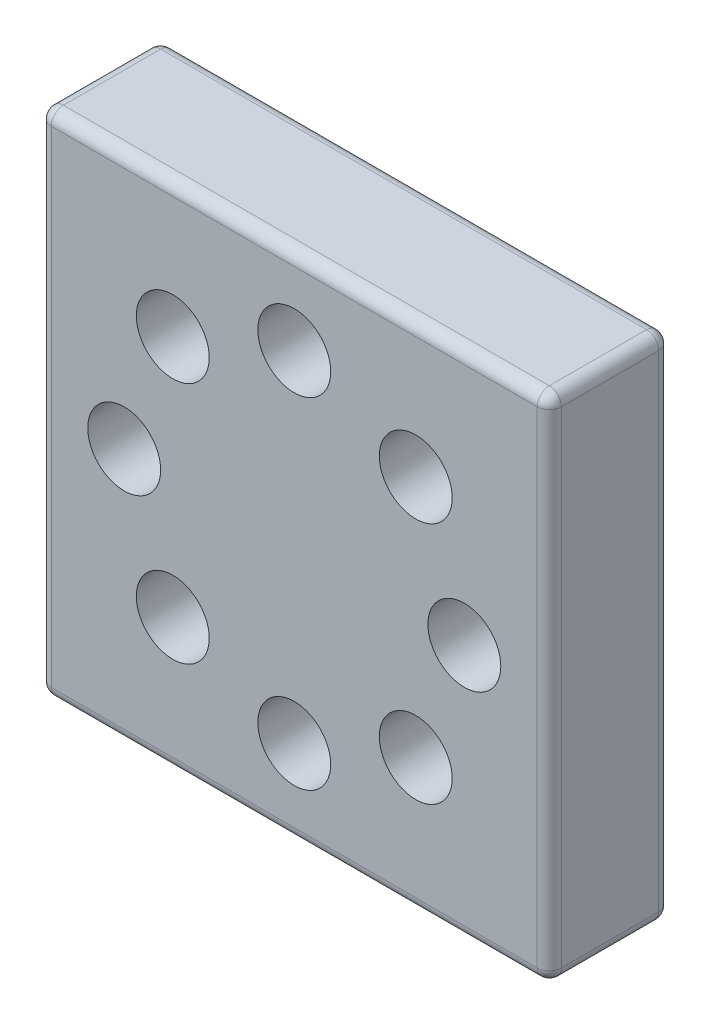
ISO-10303-21;
HEADER;
FILE_DESCRIPTION(('STEP AP214'),'2;1');
FILE_NAME('part.step','',(''),(''),'','','');
FILE_SCHEMA(('AUTOMOTIVE_DESIGN { 1 0 10303 214 1 1 1 1 }'));
ENDSEC;
DATA;
#1=APPLICATION_CONTEXT('core data for automotive mechanical design processes');
#2=APPLICATION_PROTOCOL_DEFINITION('international standard','automotive_design',2000,#1);
#3=PRODUCT_CONTEXT('',#1,'mechanical');
#4=PRODUCT('Part','Part','',(#3));
#5=PRODUCT_RELATED_PRODUCT_CATEGORY('part','',(#4));
#6=PRODUCT_DEFINITION_FORMATION('','',#4);
#7=PRODUCT_DEFINITION_CONTEXT('part definition',#1,'design');
#8=PRODUCT_DEFINITION('design','',#6,#7);
#9=PRODUCT_DEFINITION_SHAPE('','',#8);
#10=(LENGTH_UNIT() NAMED_UNIT(*) SI_UNIT(.MILLI.,.METRE.));
#11=(NAMED_UNIT(*) PLANE_ANGLE_UNIT() SI_UNIT($,.RADIAN.));
#12=(NAMED_UNIT(*) SI_UNIT($,.STERADIAN.) SOLID_ANGLE_UNIT());
#13=UNCERTAINTY_MEASURE_WITH_UNIT(LENGTH_MEASURE(1.E-05),#10,'distance_accuracy_value','');
#14=(GEOMETRIC_REPRESENTATION_CONTEXT(3) GLOBAL_UNCERTAINTY_ASSIGNED_CONTEXT((#13)) GLOBAL_UNIT_ASSIGNED_CONTEXT((#10,
#11,#12)) REPRESENTATION_CONTEXT('',''));
#15=CARTESIAN_POINT('',(0.,0.,0.));
#16=DIRECTION('',(0.,0.,1.));
#17=DIRECTION('',(1.,0.,0.));
#18=AXIS2_PLACEMENT_3D('',#15,#16,#17);
#19=CARTESIAN_POINT('',(0.,0.,5.));
#20=DIRECTION('',(0.,0.,1.));
#21=DIRECTION('',(1.,0.,0.));
#22=AXIS2_PLACEMENT_3D('',#19,#20,#21);
#23=PLANE('',#22);
#24=DIRECTION('',(0.,-1.,0.));
#25=VECTOR('',#24,1.);
#26=CARTESIAN_POINT('',(-10.,-10.5,5.));
#27=LINE('',#26,#25);
#28=CARTESIAN_POINT('',(-10.,10.,5.));
#29=VERTEX_POINT('',#28);
#30=CARTESIAN_POINT('',(-10.,-10.,5.));
#31=VERTEX_POINT('',#30);
#32=EDGE_CURVE('E337',#29,#31,#27,.T.);
#33=ORIENTED_EDGE('',*,*,#32,.T.);
#34=DIRECTION('',(1.,0.,0.));
#35=VECTOR('',#34,1.);
#36=CARTESIAN_POINT('',(10.5,-10.,5.));
#37=LINE('',#36,#35);
#38=CARTESIAN_POINT('',(10.,-10.,5.));
#39=VERTEX_POINT('',#38);
#40=EDGE_CURVE('E343',#31,#39,#37,.T.);
#41=ORIENTED_EDGE('',*,*,#40,.T.);
#42=DIRECTION('',(0.,1.,0.));
#43=VECTOR('',#42,1.);
#44=CARTESIAN_POINT('',(10.,10.5,5.));
#45=LINE('',#44,#43);
#46=CARTESIAN_POINT('',(10.,10.,5.));
#47=VERTEX_POINT('',#46);
#48=EDGE_CURVE('E340',#39,#47,#45,.T.);
#49=ORIENTED_EDGE('',*,*,#48,.T.);
#50=DIRECTION('',(-1.,0.,0.));
#51=VECTOR('',#50,1.);
#52=CARTESIAN_POINT('',(-10.5,10.,5.));
#53=LINE('',#52,#51);
#54=EDGE_CURVE('E334',#47,#29,#53,.T.);
#55=ORIENTED_EDGE('',*,*,#54,.T.);
#56=EDGE_LOOP('',(#33,#41,#49,#55));
#57=FACE_BOUND('',#56,.T.);
#58=CARTESIAN_POINT('',(-7.,0.,5.));
#59=DIRECTION('',(0.,0.,1.));
#60=DIRECTION('',(1.,0.,0.));
#61=AXIS2_PLACEMENT_3D('',#58,#59,#60);
#62=CIRCLE('',#61,1.5);
#63=CARTESIAN_POINT('',(-5.5,0.,5.));
#64=VERTEX_POINT('',#63);
#65=EDGE_CURVE('E252',#64,#64,#62,.T.);
#66=ORIENTED_EDGE('',*,*,#65,.F.);
#67=EDGE_LOOP('',(#66));
#68=FACE_BOUND('',#67,.T.);
#69=CARTESIAN_POINT('',(0.,7.,5.));
#70=DIRECTION('',(0.,0.,1.));
#71=DIRECTION('',(1.,0.,0.));
#72=AXIS2_PLACEMENT_3D('',#69,#70,#71);
#73=CIRCLE('',#72,1.5);
#74=CARTESIAN_POINT('',(1.5,7.,5.));
#75=VERTEX_POINT('',#74);
#76=EDGE_CURVE('E268',#75,#75,#73,.T.);
#77=ORIENTED_EDGE('',*,*,#76,.F.);
#78=EDGE_LOOP('',(#77));
#79=FACE_BOUND('',#78,.T.);
#80=CARTESIAN_POINT('',(5.00000029591449,-5.00000029591449,5.));
#81=DIRECTION('',(0.,0.,1.));
#82=DIRECTION('',(1.,0.,0.));
#83=AXIS2_PLACEMENT_3D('',#80,#81,#82);
#84=CIRCLE('',#83,1.5);
#85=CARTESIAN_POINT('',(6.50000029591449,-5.00000029591449,5.));
#86=VERTEX_POINT('',#85);
#87=EDGE_CURVE('E284',#86,#86,#84,.T.);
#88=ORIENTED_EDGE('',*,*,#87,.F.);
#89=EDGE_LOOP('',(#88));
#90=FACE_BOUND('',#89,.T.);
#91=CARTESIAN_POINT('',(-5.0000002959145,5.0000002959145,5.));
#92=DIRECTION('',(0.,0.,1.));
#93=DIRECTION('',(1.,0.,0.));
#94=AXIS2_PLACEMENT_3D('',#91,#92,#93);
#95=CIRCLE('',#94,1.5);
#96=CARTESIAN_POINT('',(-3.50000029591449,5.0000002959145,5.));
#97=VERTEX_POINT('',#96);
#98=EDGE_CURVE('E162',#97,#97,#95,.T.);
#99=ORIENTED_EDGE('',*,*,#98,.F.);
#100=EDGE_LOOP('',(#99));
#101=FACE_BOUND('',#100,.T.);
#102=CARTESIAN_POINT('',(4.99999970408551,4.99999970408551,5.));
#103=DIRECTION('',(0.,0.,1.));
#104=DIRECTION('',(1.,0.,0.));
#105=AXIS2_PLACEMENT_3D('',#102,#103,#104);
#106=CIRCLE('',#105,1.5);
#107=CARTESIAN_POINT('',(6.4999997040855,4.99999970408551,5.));
#108=VERTEX_POINT('',#107);
#109=EDGE_CURVE('E292',#108,#108,#106,.T.);
#110=ORIENTED_EDGE('',*,*,#109,.F.);
#111=EDGE_LOOP('',(#110));
#112=FACE_BOUND('',#111,.T.);
#113=CARTESIAN_POINT('',(-4.9999997040855,-4.99999970408551,5.));
#114=DIRECTION('',(0.,0.,1.));
#115=DIRECTION('',(1.,0.,0.));
#116=AXIS2_PLACEMENT_3D('',#113,#114,#115);
#117=CIRCLE('',#116,1.5);
#118=CARTESIAN_POINT('',(-3.4999997040855,-4.99999970408551,5.));
#119=VERTEX_POINT('',#118);
#120=EDGE_CURVE('E276',#119,#119,#117,.T.);
#121=ORIENTED_EDGE('',*,*,#120,.F.);
#122=EDGE_LOOP('',(#121));
#123=FACE_BOUND('',#122,.T.);
#124=CARTESIAN_POINT('',(7.,0.,5.));
#125=DIRECTION('',(0.,0.,1.));
#126=DIRECTION('',(1.,0.,0.));
#127=AXIS2_PLACEMENT_3D('',#124,#125,#126);
#128=CIRCLE('',#127,1.5);
#129=CARTESIAN_POINT('',(8.5,0.,5.));
#130=VERTEX_POINT('',#129);
#131=EDGE_CURVE('E260',#130,#130,#128,.T.);
#132=ORIENTED_EDGE('',*,*,#131,.F.);
#133=EDGE_LOOP('',(#132));
#134=FACE_BOUND('',#133,.T.);
#135=CARTESIAN_POINT('',(0.,-7.,5.));
#136=DIRECTION('',(0.,0.,1.));
#137=DIRECTION('',(1.,0.,0.));
#138=AXIS2_PLACEMENT_3D('',#135,#136,#137);
#139=CIRCLE('',#138,1.5);
#140=CARTESIAN_POINT('',(1.5,-7.,5.));
#141=VERTEX_POINT('',#140);
#142=EDGE_CURVE('E243',#141,#141,#139,.T.);
#143=ORIENTED_EDGE('',*,*,#142,.F.);
#144=EDGE_LOOP('',(#143));
#145=FACE_BOUND('',#144,.T.);
#146=ADVANCED_FACE('F47',(#57,#68,#79,#90,#101,#112,#123,#134,#145),#23,.T.);
#147=CARTESIAN_POINT('',(0.,0.,0.));
#148=DIRECTION('',(0.,0.,1.));
#149=DIRECTION('',(1.,0.,0.));
#150=AXIS2_PLACEMENT_3D('',#147,#148,#149);
#151=PLANE('',#150);
#152=DIRECTION('',(-1.,0.,0.));
#153=VECTOR('',#152,1.);
#154=CARTESIAN_POINT('',(0.,10.,0.));
#155=LINE('',#154,#153);
#156=CARTESIAN_POINT('',(-10.,10.,0.));
#157=VERTEX_POINT('',#156);
#158=CARTESIAN_POINT('',(10.,10.,0.));
#159=VERTEX_POINT('',#158);
#160=EDGE_CURVE('E326',#157,#159,#155,.F.);
#161=ORIENTED_EDGE('',*,*,#160,.T.);
#162=DIRECTION('',(0.,1.,0.));
#163=VECTOR('',#162,1.);
#164=CARTESIAN_POINT('',(10.,0.,0.));
#165=LINE('',#164,#163);
#166=CARTESIAN_POINT('',(10.,-10.,0.));
#167=VERTEX_POINT('',#166);
#168=EDGE_CURVE('E171',#159,#167,#165,.F.);
#169=ORIENTED_EDGE('',*,*,#168,.T.);
#170=DIRECTION('',(1.,0.,0.));
#171=VECTOR('',#170,1.);
#172=CARTESIAN_POINT('',(0.,-10.,0.));
#173=LINE('',#172,#171);
#174=CARTESIAN_POINT('',(-10.,-10.,0.));
#175=VERTEX_POINT('',#174);
#176=EDGE_CURVE('E329',#167,#175,#173,.F.);
#177=ORIENTED_EDGE('',*,*,#176,.T.);
#178=DIRECTION('',(0.,-1.,0.));
#179=VECTOR('',#178,1.);
#180=CARTESIAN_POINT('',(-10.,0.,0.));
#181=LINE('',#180,#179);
#182=EDGE_CURVE('E323',#175,#157,#181,.F.);
#183=ORIENTED_EDGE('',*,*,#182,.T.);
#184=EDGE_LOOP('',(#161,#169,#177,#183));
#185=FACE_BOUND('',#184,.T.);
#186=CARTESIAN_POINT('',(-5.0000002959145,5.0000002959145,0.));
#187=DIRECTION('',(0.,0.,1.));
#188=DIRECTION('',(1.,0.,0.));
#189=AXIS2_PLACEMENT_3D('',#186,#187,#188);
#190=CIRCLE('',#189,1.5);
#191=CARTESIAN_POINT('',(-3.50000029591449,5.0000002959145,0.));
#192=VERTEX_POINT('',#191);
#193=EDGE_CURVE('E296',#192,#192,#190,.T.);
#194=ORIENTED_EDGE('',*,*,#193,.T.);
#195=EDGE_LOOP('',(#194));
#196=FACE_BOUND('',#195,.T.);
#197=CARTESIAN_POINT('',(4.99999970408551,4.99999970408551,0.));
#198=DIRECTION('',(0.,0.,1.));
#199=DIRECTION('',(1.,0.,0.));
#200=AXIS2_PLACEMENT_3D('',#197,#198,#199);
#201=CIRCLE('',#200,1.5);
#202=CARTESIAN_POINT('',(6.4999997040855,4.99999970408551,0.));
#203=VERTEX_POINT('',#202);
#204=EDGE_CURVE('E288',#203,#203,#201,.T.);
#205=ORIENTED_EDGE('',*,*,#204,.T.);
#206=EDGE_LOOP('',(#205));
#207=FACE_BOUND('',#206,.T.);
#208=CARTESIAN_POINT('',(5.00000029591449,-5.00000029591449,0.));
#209=DIRECTION('',(0.,0.,1.));
#210=DIRECTION('',(1.,0.,0.));
#211=AXIS2_PLACEMENT_3D('',#208,#209,#210);
#212=CIRCLE('',#211,1.5);
#213=CARTESIAN_POINT('',(6.50000029591449,-5.00000029591449,0.));
#214=VERTEX_POINT('',#213);
#215=EDGE_CURVE('E280',#214,#214,#212,.T.);
#216=ORIENTED_EDGE('',*,*,#215,.T.);
#217=EDGE_LOOP('',(#216));
#218=FACE_BOUND('',#217,.T.);
#219=CARTESIAN_POINT('',(-4.9999997040855,-4.99999970408551,0.));
#220=DIRECTION('',(0.,0.,1.));
#221=DIRECTION('',(1.,0.,0.));
#222=AXIS2_PLACEMENT_3D('',#219,#220,#221);
#223=CIRCLE('',#222,1.5);
#224=CARTESIAN_POINT('',(-3.4999997040855,-4.99999970408551,0.));
#225=VERTEX_POINT('',#224);
#226=EDGE_CURVE('E272',#225,#225,#223,.T.);
#227=ORIENTED_EDGE('',*,*,#226,.T.);
#228=EDGE_LOOP('',(#227));
#229=FACE_BOUND('',#228,.T.);
#230=CARTESIAN_POINT('',(0.,7.,0.));
#231=DIRECTION('',(0.,0.,1.));
#232=DIRECTION('',(1.,0.,0.));
#233=AXIS2_PLACEMENT_3D('',#230,#231,#232);
#234=CIRCLE('',#233,1.5);
#235=CARTESIAN_POINT('',(1.5,7.,0.));
#236=VERTEX_POINT('',#235);
#237=EDGE_CURVE('E264',#236,#236,#234,.T.);
#238=ORIENTED_EDGE('',*,*,#237,.T.);
#239=EDGE_LOOP('',(#238));
#240=FACE_BOUND('',#239,.T.);
#241=CARTESIAN_POINT('',(7.,0.,0.));
#242=DIRECTION('',(0.,0.,1.));
#243=DIRECTION('',(1.,0.,0.));
#244=AXIS2_PLACEMENT_3D('',#241,#242,#243);
#245=CIRCLE('',#244,1.5);
#246=CARTESIAN_POINT('',(8.5,0.,0.));
#247=VERTEX_POINT('',#246);
#248=EDGE_CURVE('E256',#247,#247,#245,.T.);
#249=ORIENTED_EDGE('',*,*,#248,.T.);
#250=EDGE_LOOP('',(#249));
#251=FACE_BOUND('',#250,.T.);
#252=CARTESIAN_POINT('',(-7.,0.,0.));
#253=DIRECTION('',(0.,0.,1.));
#254=DIRECTION('',(1.,0.,0.));
#255=AXIS2_PLACEMENT_3D('',#252,#253,#254);
#256=CIRCLE('',#255,1.5);
#257=CARTESIAN_POINT('',(-5.5,0.,0.));
#258=VERTEX_POINT('',#257);
#259=EDGE_CURVE('E249',#258,#258,#256,.T.);
#260=ORIENTED_EDGE('',*,*,#259,.T.);
#261=EDGE_LOOP('',(#260));
#262=FACE_BOUND('',#261,.T.);
#263=CARTESIAN_POINT('',(0.,-7.,0.));
#264=DIRECTION('',(0.,0.,1.));
#265=DIRECTION('',(1.,0.,0.));
#266=AXIS2_PLACEMENT_3D('',#263,#264,#265);
#267=CIRCLE('',#266,1.5);
#268=CARTESIAN_POINT('',(1.5,-7.,0.));
#269=VERTEX_POINT('',#268);
#270=EDGE_CURVE('E236',#269,#269,#267,.T.);
#271=ORIENTED_EDGE('',*,*,#270,.T.);
#272=EDGE_LOOP('',(#271));
#273=FACE_BOUND('',#272,.T.);
#274=ADVANCED_FACE('F412',(#185,#196,#207,#218,#229,#240,#251,#262,#273),#151,.F.);
#275=CARTESIAN_POINT('',(10.5,10.5,5.));
#276=DIRECTION('',(-1.,0.,0.));
#277=DIRECTION('',(0.,-1.,0.));
#278=AXIS2_PLACEMENT_3D('',#275,#276,#277);
#279=PLANE('',#278);
#280=DIRECTION('',(0.,1.,0.));
#281=VECTOR('',#280,1.);
#282=CARTESIAN_POINT('',(10.5,-10.5,4.5));
#283=LINE('',#282,#281);
#284=CARTESIAN_POINT('',(10.5,10.,4.5));
#285=VERTEX_POINT('',#284);
#286=CARTESIAN_POINT('',(10.5,-10.,4.5));
#287=VERTEX_POINT('',#286);
#288=EDGE_CURVE('E152',#285,#287,#283,.F.);
#289=ORIENTED_EDGE('',*,*,#288,.T.);
#290=DIRECTION('',(0.,0.,-1.));
#291=VECTOR('',#290,1.);
#292=CARTESIAN_POINT('',(10.5,-10.,5.));
#293=LINE('',#292,#291);
#294=CARTESIAN_POINT('',(10.5,-10.,0.5));
#295=VERTEX_POINT('',#294);
#296=EDGE_CURVE('E147',#287,#295,#293,.T.);
#297=ORIENTED_EDGE('',*,*,#296,.T.);
#298=DIRECTION('',(0.,1.,0.));
#299=VECTOR('',#298,1.);
#300=CARTESIAN_POINT('',(10.5,10.5,0.5));
#301=LINE('',#300,#299);
#302=CARTESIAN_POINT('',(10.5,10.,0.5));
#303=VERTEX_POINT('',#302);
#304=EDGE_CURVE('E141',#295,#303,#301,.T.);
#305=ORIENTED_EDGE('',*,*,#304,.T.);
#306=DIRECTION('',(0.,0.,-1.));
#307=VECTOR('',#306,1.);
#308=CARTESIAN_POINT('',(10.5,10.,5.));
#309=LINE('',#308,#307);
#310=EDGE_CURVE('E144',#303,#285,#309,.F.);
#311=ORIENTED_EDGE('',*,*,#310,.T.);
#312=EDGE_LOOP('',(#289,#297,#305,#311));
#313=FACE_BOUND('',#312,.T.);
#314=ADVANCED_FACE('F143',(#313),#279,.F.);
#315=CARTESIAN_POINT('',(-10.5,10.5,5.));
#316=DIRECTION('',(0.,-1.,0.));
#317=DIRECTION('',(0.,0.,-1.));
#318=AXIS2_PLACEMENT_3D('',#315,#316,#317);
#319=PLANE('',#318);
#320=DIRECTION('',(-1.,0.,0.));
#321=VECTOR('',#320,1.);
#322=CARTESIAN_POINT('',(10.5,10.5,4.5));
#323=LINE('',#322,#321);
#324=CARTESIAN_POINT('',(-10.,10.5,4.5));
#325=VERTEX_POINT('',#324);
#326=CARTESIAN_POINT('',(10.,10.5,4.5));
#327=VERTEX_POINT('',#326);
#328=EDGE_CURVE('E72',#325,#327,#323,.F.);
#329=ORIENTED_EDGE('',*,*,#328,.T.);
#330=DIRECTION('',(0.,0.,-1.));
#331=VECTOR('',#330,1.);
#332=CARTESIAN_POINT('',(10.,10.5,5.));
#333=LINE('',#332,#331);
#334=CARTESIAN_POINT('',(10.,10.5,0.5));
#335=VERTEX_POINT('',#334);
#336=EDGE_CURVE('E11',#327,#335,#333,.T.);
#337=ORIENTED_EDGE('',*,*,#336,.T.);
#338=DIRECTION('',(-1.,0.,0.));
#339=VECTOR('',#338,1.);
#340=CARTESIAN_POINT('',(-10.5,10.5,0.5));
#341=LINE('',#340,#339);
#342=CARTESIAN_POINT('',(-10.,10.5,0.5));
#343=VERTEX_POINT('',#342);
#344=EDGE_CURVE('E57',#335,#343,#341,.T.);
#345=ORIENTED_EDGE('',*,*,#344,.T.);
#346=DIRECTION('',(0.,0.,-1.));
#347=VECTOR('',#346,1.);
#348=CARTESIAN_POINT('',(-10.,10.5,5.));
#349=LINE('',#348,#347);
#350=EDGE_CURVE('E360',#343,#325,#349,.F.);
#351=ORIENTED_EDGE('',*,*,#350,.T.);
#352=EDGE_LOOP('',(#329,#337,#345,#351));
#353=FACE_BOUND('',#352,.T.);
#354=ADVANCED_FACE('F418',(#353),#319,.F.);
#355=CARTESIAN_POINT('',(-10.5,10.5,5.));
#356=DIRECTION('',(1.,0.,0.));
#357=DIRECTION('',(0.,0.,-1.));
#358=AXIS2_PLACEMENT_3D('',#355,#356,#357);
#359=PLANE('',#358);
#360=DIRECTION('',(0.,-1.,0.));
#361=VECTOR('',#360,1.);
#362=CARTESIAN_POINT('',(-10.5,10.5,0.5));
#363=LINE('',#362,#361);
#364=CARTESIAN_POINT('',(-10.5,10.,0.5));
#365=VERTEX_POINT('',#364);
#366=CARTESIAN_POINT('',(-10.5,-10.,0.5));
#367=VERTEX_POINT('',#366);
#368=EDGE_CURVE('E353',#365,#367,#363,.T.);
#369=ORIENTED_EDGE('',*,*,#368,.T.);
#370=DIRECTION('',(0.,0.,-1.));
#371=VECTOR('',#370,1.);
#372=CARTESIAN_POINT('',(-10.5,-10.,5.));
#373=LINE('',#372,#371);
#374=CARTESIAN_POINT('',(-10.5,-10.,4.5));
#375=VERTEX_POINT('',#374);
#376=EDGE_CURVE('E356',#367,#375,#373,.F.);
#377=ORIENTED_EDGE('',*,*,#376,.T.);
#378=DIRECTION('',(0.,-1.,0.));
#379=VECTOR('',#378,1.);
#380=CARTESIAN_POINT('',(-10.5,10.5,4.5));
#381=LINE('',#380,#379);
#382=CARTESIAN_POINT('',(-10.5,10.,4.5));
#383=VERTEX_POINT('',#382);
#384=EDGE_CURVE('E350',#375,#383,#381,.F.);
#385=ORIENTED_EDGE('',*,*,#384,.T.);
#386=DIRECTION('',(0.,0.,-1.));
#387=VECTOR('',#386,1.);
#388=CARTESIAN_POINT('',(-10.5,10.,5.));
#389=LINE('',#388,#387);
#390=EDGE_CURVE('E347',#383,#365,#389,.T.);
#391=ORIENTED_EDGE('',*,*,#390,.T.);
#392=EDGE_LOOP('',(#369,#377,#385,#391));
#393=FACE_BOUND('',#392,.T.);
#394=ADVANCED_FACE('F470',(#393),#359,.F.);
#395=CARTESIAN_POINT('',(-10.5,-10.5,5.));
#396=DIRECTION('',(0.,1.,0.));
#397=DIRECTION('',(0.,0.,1.));
#398=AXIS2_PLACEMENT_3D('',#395,#396,#397);
#399=PLANE('',#398);
#400=DIRECTION('',(1.,0.,0.));
#401=VECTOR('',#400,1.);
#402=CARTESIAN_POINT('',(-10.5,-10.5,0.5));
#403=LINE('',#402,#401);
#404=CARTESIAN_POINT('',(-10.,-10.5,0.5));
#405=VERTEX_POINT('',#404);
#406=CARTESIAN_POINT('',(10.,-10.5,0.5));
#407=VERTEX_POINT('',#406);
#408=EDGE_CURVE('E316',#405,#407,#403,.T.);
#409=ORIENTED_EDGE('',*,*,#408,.T.);
#410=DIRECTION('',(0.,0.,-1.));
#411=VECTOR('',#410,1.);
#412=CARTESIAN_POINT('',(10.,-10.5,5.));
#413=LINE('',#412,#411);
#414=CARTESIAN_POINT('',(10.,-10.5,4.5));
#415=VERTEX_POINT('',#414);
#416=EDGE_CURVE('E319',#407,#415,#413,.F.);
#417=ORIENTED_EDGE('',*,*,#416,.T.);
#418=DIRECTION('',(1.,0.,0.));
#419=VECTOR('',#418,1.);
#420=CARTESIAN_POINT('',(-10.5,-10.5,4.5));
#421=LINE('',#420,#419);
#422=CARTESIAN_POINT('',(-10.,-10.5,4.5));
#423=VERTEX_POINT('',#422);
#424=EDGE_CURVE('E313',#415,#423,#421,.F.);
#425=ORIENTED_EDGE('',*,*,#424,.T.);
#426=DIRECTION('',(0.,0.,-1.));
#427=VECTOR('',#426,1.);
#428=CARTESIAN_POINT('',(-10.,-10.5,5.));
#429=LINE('',#428,#427);
#430=EDGE_CURVE('E310',#423,#405,#429,.T.);
#431=ORIENTED_EDGE('',*,*,#430,.T.);
#432=EDGE_LOOP('',(#409,#417,#425,#431));
#433=FACE_BOUND('',#432,.T.);
#434=ADVANCED_FACE('F398',(#433),#399,.F.);
#435=CARTESIAN_POINT('',(-5.0000002959145,5.0000002959145,5.));
#436=DIRECTION('',(0.,0.,-1.));
#437=DIRECTION('',(-1.,0.,0.));
#438=AXIS2_PLACEMENT_3D('',#435,#436,#437);
#439=CYLINDRICAL_SURFACE('',#438,1.5);
#440=ORIENTED_EDGE('',*,*,#98,.T.);
#441=EDGE_LOOP('',(#440));
#442=FACE_BOUND('',#441,.T.);
#443=ORIENTED_EDGE('',*,*,#193,.F.);
#444=EDGE_LOOP('',(#443));
#445=FACE_BOUND('',#444,.T.);
#446=ADVANCED_FACE('F465',(#442,#445),#439,.F.);
#447=CARTESIAN_POINT('',(4.99999970408551,4.99999970408551,5.));
#448=DIRECTION('',(0.,0.,-1.));
#449=DIRECTION('',(-1.,0.,0.));
#450=AXIS2_PLACEMENT_3D('',#447,#448,#449);
#451=CYLINDRICAL_SURFACE('',#450,1.5);
#452=ORIENTED_EDGE('',*,*,#109,.T.);
#453=EDGE_LOOP('',(#452));
#454=FACE_BOUND('',#453,.T.);
#455=ORIENTED_EDGE('',*,*,#204,.F.);
#456=EDGE_LOOP('',(#455));
#457=FACE_BOUND('',#456,.T.);
#458=ADVANCED_FACE('F677',(#454,#457),#451,.F.);
#459=CARTESIAN_POINT('',(5.00000029591449,-5.00000029591449,5.));
#460=DIRECTION('',(0.,0.,-1.));
#461=DIRECTION('',(-1.,0.,0.));
#462=AXIS2_PLACEMENT_3D('',#459,#460,#461);
#463=CYLINDRICAL_SURFACE('',#462,1.5);
#464=ORIENTED_EDGE('',*,*,#87,.T.);
#465=EDGE_LOOP('',(#464));
#466=FACE_BOUND('',#465,.T.);
#467=ORIENTED_EDGE('',*,*,#215,.F.);
#468=EDGE_LOOP('',(#467));
#469=FACE_BOUND('',#468,.T.);
#470=ADVANCED_FACE('F668',(#466,#469),#463,.F.);
#471=CARTESIAN_POINT('',(-4.9999997040855,-4.99999970408551,5.));
#472=DIRECTION('',(0.,0.,-1.));
#473=DIRECTION('',(-1.,0.,0.));
#474=AXIS2_PLACEMENT_3D('',#471,#472,#473);
#475=CYLINDRICAL_SURFACE('',#474,1.5);
#476=ORIENTED_EDGE('',*,*,#120,.T.);
#477=EDGE_LOOP('',(#476));
#478=FACE_BOUND('',#477,.T.);
#479=ORIENTED_EDGE('',*,*,#226,.F.);
#480=EDGE_LOOP('',(#479));
#481=FACE_BOUND('',#480,.T.);
#482=ADVANCED_FACE('F659',(#478,#481),#475,.F.);
#483=CARTESIAN_POINT('',(0.,7.,5.));
#484=DIRECTION('',(0.,0.,-1.));
#485=DIRECTION('',(-1.,0.,0.));
#486=AXIS2_PLACEMENT_3D('',#483,#484,#485);
#487=CYLINDRICAL_SURFACE('',#486,1.5);
#488=ORIENTED_EDGE('',*,*,#76,.T.);
#489=EDGE_LOOP('',(#488));
#490=FACE_BOUND('',#489,.T.);
#491=ORIENTED_EDGE('',*,*,#237,.F.);
#492=EDGE_LOOP('',(#491));
#493=FACE_BOUND('',#492,.T.);
#494=ADVANCED_FACE('F650',(#490,#493),#487,.F.);
#495=CARTESIAN_POINT('',(7.,0.,5.));
#496=DIRECTION('',(0.,0.,-1.));
#497=DIRECTION('',(-1.,0.,0.));
#498=AXIS2_PLACEMENT_3D('',#495,#496,#497);
#499=CYLINDRICAL_SURFACE('',#498,1.5);
#500=ORIENTED_EDGE('',*,*,#131,.T.);
#501=EDGE_LOOP('',(#500));
#502=FACE_BOUND('',#501,.T.);
#503=ORIENTED_EDGE('',*,*,#248,.F.);
#504=EDGE_LOOP('',(#503));
#505=FACE_BOUND('',#504,.T.);
#506=ADVANCED_FACE('F641',(#502,#505),#499,.F.);
#507=CARTESIAN_POINT('',(-7.,0.,5.));
#508=DIRECTION('',(0.,0.,-1.));
#509=DIRECTION('',(-1.,0.,0.));
#510=AXIS2_PLACEMENT_3D('',#507,#508,#509);
#511=CYLINDRICAL_SURFACE('',#510,1.5);
#512=ORIENTED_EDGE('',*,*,#65,.T.);
#513=EDGE_LOOP('',(#512));
#514=FACE_BOUND('',#513,.T.);
#515=ORIENTED_EDGE('',*,*,#259,.F.);
#516=EDGE_LOOP('',(#515));
#517=FACE_BOUND('',#516,.T.);
#518=ADVANCED_FACE('F632',(#514,#517),#511,.F.);
#519=CARTESIAN_POINT('',(0.,-7.,5.));
#520=DIRECTION('',(0.,0.,-1.));
#521=DIRECTION('',(-1.,0.,0.));
#522=AXIS2_PLACEMENT_3D('',#519,#520,#521);
#523=CYLINDRICAL_SURFACE('',#522,1.5);
#524=ORIENTED_EDGE('',*,*,#142,.T.);
#525=EDGE_LOOP('',(#524));
#526=FACE_BOUND('',#525,.T.);
#527=ORIENTED_EDGE('',*,*,#270,.F.);
#528=EDGE_LOOP('',(#527));
#529=FACE_BOUND('',#528,.T.);
#530=ADVANCED_FACE('F625',(#526,#529),#523,.F.);
#531=CARTESIAN_POINT('',(-10.,10.,5.));
#532=DIRECTION('',(0.,0.,-1.));
#533=DIRECTION('',(-1.,0.,0.));
#534=AXIS2_PLACEMENT_3D('',#531,#532,#533);
#535=CYLINDRICAL_SURFACE('',#534,0.5);
#536=CARTESIAN_POINT('',(-10.,10.,4.5));
#537=DIRECTION('',(0.,0.,1.));
#538=DIRECTION('',(1.,0.,0.));
#539=AXIS2_PLACEMENT_3D('',#536,#537,#538);
#540=CIRCLE('',#539,0.5);
#541=EDGE_CURVE('E51',#325,#383,#540,.T.);
#542=ORIENTED_EDGE('',*,*,#541,.F.);
#543=ORIENTED_EDGE('',*,*,#350,.F.);
#544=CARTESIAN_POINT('',(-10.,10.,0.5));
#545=DIRECTION('',(0.,0.,-1.));
#546=DIRECTION('',(-1.,0.,0.));
#547=AXIS2_PLACEMENT_3D('',#544,#545,#546);
#548=CIRCLE('',#547,0.5);
#549=EDGE_CURVE('E227',#365,#343,#548,.T.);
#550=ORIENTED_EDGE('',*,*,#549,.F.);
#551=ORIENTED_EDGE('',*,*,#390,.F.);
#552=EDGE_LOOP('',(#542,#543,#550,#551));
#553=FACE_BOUND('',#552,.T.);
#554=ADVANCED_FACE('F49',(#553),#535,.T.);
#555=CARTESIAN_POINT('',(-10.,10.,4.5));
#556=DIRECTION('',(-1.,0.,0.));
#557=DIRECTION('',(0.,0.,1.));
#558=AXIS2_PLACEMENT_3D('',#555,#556,#557);
#559=SPHERICAL_SURFACE('',#558,0.5);
#560=CARTESIAN_POINT('',(-10.,10.,4.5));
#561=DIRECTION('',(-1.,0.,0.));
#562=DIRECTION('',(0.,0.,1.));
#563=AXIS2_PLACEMENT_3D('',#560,#561,#562);
#564=CIRCLE('',#563,0.5);
#565=EDGE_CURVE('E220',#325,#29,#564,.F.);
#566=ORIENTED_EDGE('',*,*,#565,.F.);
#567=ORIENTED_EDGE('',*,*,#541,.T.);
#568=CARTESIAN_POINT('',(-10.,10.,4.5));
#569=DIRECTION('',(0.,1.,0.));
#570=DIRECTION('',(0.,0.,1.));
#571=AXIS2_PLACEMENT_3D('',#568,#569,#570);
#572=CIRCLE('',#571,0.5);
#573=EDGE_CURVE('E224',#29,#383,#572,.F.);
#574=ORIENTED_EDGE('',*,*,#573,.F.);
#575=EDGE_LOOP('',(#566,#567,#574));
#576=FACE_BOUND('',#575,.T.);
#577=ADVANCED_FACE('F450',(#576),#559,.T.);
#578=CARTESIAN_POINT('',(-10.,10.,0.5));
#579=DIRECTION('',(0.,1.,0.));
#580=DIRECTION('',(0.,0.,1.));
#581=AXIS2_PLACEMENT_3D('',#578,#579,#580);
#582=SPHERICAL_SURFACE('',#581,0.5);
#583=CARTESIAN_POINT('',(-10.,10.,0.5));
#584=DIRECTION('',(0.,1.,0.));
#585=DIRECTION('',(0.,0.,1.));
#586=AXIS2_PLACEMENT_3D('',#583,#584,#585);
#587=CIRCLE('',#586,0.5);
#588=EDGE_CURVE('E212',#365,#157,#587,.F.);
#589=ORIENTED_EDGE('',*,*,#588,.F.);
#590=ORIENTED_EDGE('',*,*,#549,.T.);
#591=CARTESIAN_POINT('',(-10.,10.,0.5));
#592=DIRECTION('',(-1.,0.,0.));
#593=DIRECTION('',(0.,0.,1.));
#594=AXIS2_PLACEMENT_3D('',#591,#592,#593);
#595=CIRCLE('',#594,0.5);
#596=EDGE_CURVE('E216',#157,#343,#595,.F.);
#597=ORIENTED_EDGE('',*,*,#596,.F.);
#598=EDGE_LOOP('',(#589,#590,#597));
#599=FACE_BOUND('',#598,.T.);
#600=ADVANCED_FACE('F448',(#599),#582,.T.);
#601=CARTESIAN_POINT('',(-10.,0.,4.5));
#602=DIRECTION('',(0.,1.,0.));
#603=DIRECTION('',(0.,0.,1.));
#604=AXIS2_PLACEMENT_3D('',#601,#602,#603);
#605=CYLINDRICAL_SURFACE('',#604,0.5);
#606=ORIENTED_EDGE('',*,*,#573,.T.);
#607=ORIENTED_EDGE('',*,*,#384,.F.);
#608=CARTESIAN_POINT('',(-10.,-10.,4.5));
#609=DIRECTION('',(0.,-1.,0.));
#610=DIRECTION('',(0.,0.,-1.));
#611=AXIS2_PLACEMENT_3D('',#608,#609,#610);
#612=CIRCLE('',#611,0.5);
#613=EDGE_CURVE('E205',#31,#375,#612,.T.);
#614=ORIENTED_EDGE('',*,*,#613,.F.);
#615=ORIENTED_EDGE('',*,*,#32,.F.);
#616=EDGE_LOOP('',(#606,#607,#614,#615));
#617=FACE_BOUND('',#616,.T.);
#618=ADVANCED_FACE('F434',(#617),#605,.T.);
#619=CARTESIAN_POINT('',(0.,10.,4.5));
#620=DIRECTION('',(1.,0.,0.));
#621=DIRECTION('',(0.,0.,-1.));
#622=AXIS2_PLACEMENT_3D('',#619,#620,#621);
#623=CYLINDRICAL_SURFACE('',#622,0.5);
#624=ORIENTED_EDGE('',*,*,#565,.T.);
#625=ORIENTED_EDGE('',*,*,#54,.F.);
#626=CARTESIAN_POINT('',(10.,10.,4.5));
#627=DIRECTION('',(1.,0.,0.));
#628=DIRECTION('',(0.,0.,-1.));
#629=AXIS2_PLACEMENT_3D('',#626,#627,#628);
#630=CIRCLE('',#629,0.5);
#631=EDGE_CURVE('E201',#327,#47,#630,.T.);
#632=ORIENTED_EDGE('',*,*,#631,.F.);
#633=ORIENTED_EDGE('',*,*,#328,.F.);
#634=EDGE_LOOP('',(#624,#625,#632,#633));
#635=FACE_BOUND('',#634,.T.);
#636=ADVANCED_FACE('F422',(#635),#623,.T.);
#637=CARTESIAN_POINT('',(10.,10.,5.));
#638=DIRECTION('',(0.,0.,-1.));
#639=DIRECTION('',(-1.,0.,0.));
#640=AXIS2_PLACEMENT_3D('',#637,#638,#639);
#641=CYLINDRICAL_SURFACE('',#640,0.5);
#642=CARTESIAN_POINT('',(10.,10.,0.5));
#643=DIRECTION('',(0.,0.,-1.));
#644=DIRECTION('',(-1.,0.,0.));
#645=AXIS2_PLACEMENT_3D('',#642,#643,#644);
#646=CIRCLE('',#645,0.5);
#647=EDGE_CURVE('E156',#335,#303,#646,.T.);
#648=ORIENTED_EDGE('',*,*,#647,.F.);
#649=ORIENTED_EDGE('',*,*,#336,.F.);
#650=CARTESIAN_POINT('',(10.,10.,4.5));
#651=DIRECTION('',(0.,0.,1.));
#652=DIRECTION('',(1.,0.,0.));
#653=AXIS2_PLACEMENT_3D('',#650,#651,#652);
#654=CIRCLE('',#653,0.5);
#655=EDGE_CURVE('E159',#285,#327,#654,.T.);
#656=ORIENTED_EDGE('',*,*,#655,.F.);
#657=ORIENTED_EDGE('',*,*,#310,.F.);
#658=EDGE_LOOP('',(#648,#649,#656,#657));
#659=FACE_BOUND('',#658,.T.);
#660=ADVANCED_FACE('F155',(#659),#641,.T.);
#661=CARTESIAN_POINT('',(-10.5,10.,0.5));
#662=DIRECTION('',(-1.,0.,0.));
#663=DIRECTION('',(0.,0.,1.));
#664=AXIS2_PLACEMENT_3D('',#661,#662,#663);
#665=CYLINDRICAL_SURFACE('',#664,0.5);
#666=ORIENTED_EDGE('',*,*,#596,.T.);
#667=ORIENTED_EDGE('',*,*,#344,.F.);
#668=CARTESIAN_POINT('',(10.,10.,0.5));
#669=DIRECTION('',(1.,0.,0.));
#670=DIRECTION('',(0.,0.,-1.));
#671=AXIS2_PLACEMENT_3D('',#668,#669,#670);
#672=CIRCLE('',#671,0.5);
#673=EDGE_CURVE('E65',#159,#335,#672,.T.);
#674=ORIENTED_EDGE('',*,*,#673,.F.);
#675=ORIENTED_EDGE('',*,*,#160,.F.);
#676=EDGE_LOOP('',(#666,#667,#674,#675));
#677=FACE_BOUND('',#676,.T.);
#678=ADVANCED_FACE('F416',(#677),#665,.T.);
#679=CARTESIAN_POINT('',(-10.,10.5,0.5));
#680=DIRECTION('',(0.,-1.,0.));
#681=DIRECTION('',(0.,0.,-1.));
#682=AXIS2_PLACEMENT_3D('',#679,#680,#681);
#683=CYLINDRICAL_SURFACE('',#682,0.5);
#684=ORIENTED_EDGE('',*,*,#588,.T.);
#685=ORIENTED_EDGE('',*,*,#182,.F.);
#686=CARTESIAN_POINT('',(-10.,-10.,0.5));
#687=DIRECTION('',(0.,-1.,0.));
#688=DIRECTION('',(0.,0.,-1.));
#689=AXIS2_PLACEMENT_3D('',#686,#687,#688);
#690=CIRCLE('',#689,0.5);
#691=EDGE_CURVE('E193',#367,#175,#690,.T.);
#692=ORIENTED_EDGE('',*,*,#691,.F.);
#693=ORIENTED_EDGE('',*,*,#368,.F.);
#694=EDGE_LOOP('',(#684,#685,#692,#693));
#695=FACE_BOUND('',#694,.T.);
#696=ADVANCED_FACE('F447',(#695),#683,.T.);
#697=CARTESIAN_POINT('',(-10.,-10.,5.));
#698=DIRECTION('',(0.,0.,-1.));
#699=DIRECTION('',(-1.,0.,0.));
#700=AXIS2_PLACEMENT_3D('',#697,#698,#699);
#701=CYLINDRICAL_SURFACE('',#700,0.5);
#702=CARTESIAN_POINT('',(-10.,-10.,4.5));
#703=DIRECTION('',(0.,0.,1.));
#704=DIRECTION('',(1.,0.,0.));
#705=AXIS2_PLACEMENT_3D('',#702,#703,#704);
#706=CIRCLE('',#705,0.5);
#707=EDGE_CURVE('E208',#375,#423,#706,.T.);
#708=ORIENTED_EDGE('',*,*,#707,.F.);
#709=ORIENTED_EDGE('',*,*,#376,.F.);
#710=CARTESIAN_POINT('',(-10.,-10.,0.5));
#711=DIRECTION('',(0.,0.,-1.));
#712=DIRECTION('',(-1.,0.,0.));
#713=AXIS2_PLACEMENT_3D('',#710,#711,#712);
#714=CIRCLE('',#713,0.5);
#715=EDGE_CURVE('E189',#405,#367,#714,.T.);
#716=ORIENTED_EDGE('',*,*,#715,.F.);
#717=ORIENTED_EDGE('',*,*,#430,.F.);
#718=EDGE_LOOP('',(#708,#709,#716,#717));
#719=FACE_BOUND('',#718,.T.);
#720=ADVANCED_FACE('F440',(#719),#701,.T.);
#721=CARTESIAN_POINT('',(-10.,-10.,4.5));
#722=DIRECTION('',(-1.,0.,0.));
#723=DIRECTION('',(0.,0.,1.));
#724=AXIS2_PLACEMENT_3D('',#721,#722,#723);
#725=SPHERICAL_SURFACE('',#724,0.5);
#726=ORIENTED_EDGE('',*,*,#613,.T.);
#727=ORIENTED_EDGE('',*,*,#707,.T.);
#728=CARTESIAN_POINT('',(-10.,-10.,4.5));
#729=DIRECTION('',(-1.,0.,0.));
#730=DIRECTION('',(0.,0.,1.));
#731=AXIS2_PLACEMENT_3D('',#728,#729,#730);
#732=CIRCLE('',#731,0.5);
#733=EDGE_CURVE('E179',#31,#423,#732,.F.);
#734=ORIENTED_EDGE('',*,*,#733,.F.);
#735=EDGE_LOOP('',(#726,#727,#734));
#736=FACE_BOUND('',#735,.T.);
#737=ADVANCED_FACE('F437',(#736),#725,.T.);
#738=CARTESIAN_POINT('',(10.,10.,4.5));
#739=DIRECTION('',(0.,1.,0.));
#740=DIRECTION('',(0.,0.,1.));
#741=AXIS2_PLACEMENT_3D('',#738,#739,#740);
#742=SPHERICAL_SURFACE('',#741,0.5);
#743=ORIENTED_EDGE('',*,*,#655,.T.);
#744=ORIENTED_EDGE('',*,*,#631,.T.);
#745=CARTESIAN_POINT('',(10.,10.,4.5));
#746=DIRECTION('',(0.,1.,0.));
#747=DIRECTION('',(0.,0.,1.));
#748=AXIS2_PLACEMENT_3D('',#745,#746,#747);
#749=CIRCLE('',#748,0.5);
#750=EDGE_CURVE('E173',#285,#47,#749,.F.);
#751=ORIENTED_EDGE('',*,*,#750,.F.);
#752=EDGE_LOOP('',(#743,#744,#751));
#753=FACE_BOUND('',#752,.T.);
#754=ADVANCED_FACE('F424',(#753),#742,.T.);
#755=CARTESIAN_POINT('',(10.,10.,0.5));
#756=DIRECTION('',(0.,1.,0.));
#757=DIRECTION('',(0.,0.,1.));
#758=AXIS2_PLACEMENT_3D('',#755,#756,#757);
#759=SPHERICAL_SURFACE('',#758,0.5);
#760=ORIENTED_EDGE('',*,*,#673,.T.);
#761=ORIENTED_EDGE('',*,*,#647,.T.);
#762=CARTESIAN_POINT('',(10.,10.,0.5));
#763=DIRECTION('',(0.,1.,0.));
#764=DIRECTION('',(0.,0.,1.));
#765=AXIS2_PLACEMENT_3D('',#762,#763,#764);
#766=CIRCLE('',#765,0.5);
#767=EDGE_CURVE('E165',#159,#303,#766,.F.);
#768=ORIENTED_EDGE('',*,*,#767,.F.);
#769=EDGE_LOOP('',(#760,#761,#768));
#770=FACE_BOUND('',#769,.T.);
#771=ADVANCED_FACE('F164',(#770),#759,.T.);
#772=CARTESIAN_POINT('',(-10.,-10.,0.5));
#773=DIRECTION('',(-1.,0.,0.));
#774=DIRECTION('',(0.,0.,1.));
#775=AXIS2_PLACEMENT_3D('',#772,#773,#774);
#776=SPHERICAL_SURFACE('',#775,0.5);
#777=ORIENTED_EDGE('',*,*,#715,.T.);
#778=ORIENTED_EDGE('',*,*,#691,.T.);
#779=CARTESIAN_POINT('',(-10.,-10.,0.5));
#780=DIRECTION('',(-1.,0.,0.));
#781=DIRECTION('',(0.,0.,1.));
#782=AXIS2_PLACEMENT_3D('',#779,#780,#781);
#783=CIRCLE('',#782,0.5);
#784=EDGE_CURVE('E174',#405,#175,#783,.F.);
#785=ORIENTED_EDGE('',*,*,#784,.F.);
#786=EDGE_LOOP('',(#777,#778,#785));
#787=FACE_BOUND('',#786,.T.);
#788=ADVANCED_FACE('F444',(#787),#776,.T.);
#789=CARTESIAN_POINT('',(0.,-10.,4.5));
#790=DIRECTION('',(-1.,0.,0.));
#791=DIRECTION('',(0.,0.,1.));
#792=AXIS2_PLACEMENT_3D('',#789,#790,#791);
#793=CYLINDRICAL_SURFACE('',#792,0.5);
#794=ORIENTED_EDGE('',*,*,#733,.T.);
#795=ORIENTED_EDGE('',*,*,#424,.F.);
#796=CARTESIAN_POINT('',(10.,-10.,4.5));
#797=DIRECTION('',(1.,0.,0.));
#798=DIRECTION('',(0.,0.,-1.));
#799=AXIS2_PLACEMENT_3D('',#796,#797,#798);
#800=CIRCLE('',#799,0.5);
#801=EDGE_CURVE('E182',#39,#415,#800,.T.);
#802=ORIENTED_EDGE('',*,*,#801,.F.);
#803=ORIENTED_EDGE('',*,*,#40,.F.);
#804=EDGE_LOOP('',(#794,#795,#802,#803));
#805=FACE_BOUND('',#804,.T.);
#806=ADVANCED_FACE('F393',(#805),#793,.T.);
#807=CARTESIAN_POINT('',(10.,0.,4.5));
#808=DIRECTION('',(0.,-1.,0.));
#809=DIRECTION('',(1.,0.,0.));
#810=AXIS2_PLACEMENT_3D('',#807,#808,#809);
#811=CYLINDRICAL_SURFACE('',#810,0.5);
#812=ORIENTED_EDGE('',*,*,#750,.T.);
#813=ORIENTED_EDGE('',*,*,#48,.F.);
#814=CARTESIAN_POINT('',(10.,-10.,4.5));
#815=DIRECTION('',(0.,-1.,0.));
#816=DIRECTION('',(0.,0.,-1.));
#817=AXIS2_PLACEMENT_3D('',#814,#815,#816);
#818=CIRCLE('',#817,0.5);
#819=EDGE_CURVE('E380',#287,#39,#818,.T.);
#820=ORIENTED_EDGE('',*,*,#819,.F.);
#821=ORIENTED_EDGE('',*,*,#288,.F.);
#822=EDGE_LOOP('',(#812,#813,#820,#821));
#823=FACE_BOUND('',#822,.T.);
#824=ADVANCED_FACE('F427',(#823),#811,.T.);
#825=CARTESIAN_POINT('',(10.,10.5,0.5));
#826=DIRECTION('',(0.,1.,0.));
#827=DIRECTION('',(-1.,0.,0.));
#828=AXIS2_PLACEMENT_3D('',#825,#826,#827);
#829=CYLINDRICAL_SURFACE('',#828,0.5);
#830=ORIENTED_EDGE('',*,*,#767,.T.);
#831=ORIENTED_EDGE('',*,*,#304,.F.);
#832=CARTESIAN_POINT('',(10.,-10.,0.5));
#833=DIRECTION('',(0.,-1.,0.));
#834=DIRECTION('',(0.,0.,-1.));
#835=AXIS2_PLACEMENT_3D('',#832,#833,#834);
#836=CIRCLE('',#835,0.5);
#837=EDGE_CURVE('E376',#167,#295,#836,.T.);
#838=ORIENTED_EDGE('',*,*,#837,.F.);
#839=ORIENTED_EDGE('',*,*,#168,.F.);
#840=EDGE_LOOP('',(#830,#831,#838,#839));
#841=FACE_BOUND('',#840,.T.);
#842=ADVANCED_FACE('F169',(#841),#829,.T.);
#843=CARTESIAN_POINT('',(-10.5,-10.,0.5));
#844=DIRECTION('',(1.,0.,0.));
#845=DIRECTION('',(0.,0.,-1.));
#846=AXIS2_PLACEMENT_3D('',#843,#844,#845);
#847=CYLINDRICAL_SURFACE('',#846,0.5);
#848=ORIENTED_EDGE('',*,*,#784,.T.);
#849=ORIENTED_EDGE('',*,*,#176,.F.);
#850=CARTESIAN_POINT('',(10.,-10.,0.5));
#851=DIRECTION('',(1.,0.,0.));
#852=DIRECTION('',(0.,0.,-1.));
#853=AXIS2_PLACEMENT_3D('',#850,#851,#852);
#854=CIRCLE('',#853,0.5);
#855=EDGE_CURVE('E373',#407,#167,#854,.T.);
#856=ORIENTED_EDGE('',*,*,#855,.F.);
#857=ORIENTED_EDGE('',*,*,#408,.F.);
#858=EDGE_LOOP('',(#848,#849,#856,#857));
#859=FACE_BOUND('',#858,.T.);
#860=ADVANCED_FACE('F408',(#859),#847,.T.);
#861=CARTESIAN_POINT('',(10.,-10.,4.5));
#862=DIRECTION('',(0.,0.,1.));
#863=DIRECTION('',(1.,0.,0.));
#864=AXIS2_PLACEMENT_3D('',#861,#862,#863);
#865=SPHERICAL_SURFACE('',#864,0.5);
#866=ORIENTED_EDGE('',*,*,#819,.T.);
#867=ORIENTED_EDGE('',*,*,#801,.T.);
#868=CARTESIAN_POINT('',(10.,-10.,4.5));
#869=DIRECTION('',(0.,0.,1.));
#870=DIRECTION('',(1.,0.,0.));
#871=AXIS2_PLACEMENT_3D('',#868,#869,#870);
#872=CIRCLE('',#871,0.5);
#873=EDGE_CURVE('E370',#287,#415,#872,.F.);
#874=ORIENTED_EDGE('',*,*,#873,.F.);
#875=EDGE_LOOP('',(#866,#867,#874));
#876=FACE_BOUND('',#875,.T.);
#877=ADVANCED_FACE('F388',(#876),#865,.T.);
#878=CARTESIAN_POINT('',(10.,-10.,0.5));
#879=DIRECTION('',(0.,0.,-1.));
#880=DIRECTION('',(-1.,0.,0.));
#881=AXIS2_PLACEMENT_3D('',#878,#879,#880);
#882=SPHERICAL_SURFACE('',#881,0.5);
#883=ORIENTED_EDGE('',*,*,#855,.T.);
#884=ORIENTED_EDGE('',*,*,#837,.T.);
#885=CARTESIAN_POINT('',(10.,-10.,0.5));
#886=DIRECTION('',(0.,0.,-1.));
#887=DIRECTION('',(-1.,0.,0.));
#888=AXIS2_PLACEMENT_3D('',#885,#886,#887);
#889=CIRCLE('',#888,0.5);
#890=EDGE_CURVE('E367',#407,#295,#889,.F.);
#891=ORIENTED_EDGE('',*,*,#890,.F.);
#892=EDGE_LOOP('',(#883,#884,#891));
#893=FACE_BOUND('',#892,.T.);
#894=ADVANCED_FACE('F405',(#893),#882,.T.);
#895=CARTESIAN_POINT('',(10.,-10.,5.));
#896=DIRECTION('',(0.,0.,-1.));
#897=DIRECTION('',(-1.,0.,0.));
#898=AXIS2_PLACEMENT_3D('',#895,#896,#897);
#899=CYLINDRICAL_SURFACE('',#898,0.5);
#900=ORIENTED_EDGE('',*,*,#873,.T.);
#901=ORIENTED_EDGE('',*,*,#416,.F.);
#902=ORIENTED_EDGE('',*,*,#890,.T.);
#903=ORIENTED_EDGE('',*,*,#296,.F.);
#904=EDGE_LOOP('',(#900,#901,#902,#903));
#905=FACE_BOUND('',#904,.T.);
#906=ADVANCED_FACE('F403',(#905),#899,.T.);
#907=CLOSED_SHELL('',(#146,#274,#314,#354,#394,#434,#446,#458,#470,#482,#494,#506,#518,#530,
#554,#577,#600,#618,#636,#660,#678,#696,#720,#737,#754,#771,#788,#806,#824,#842,#860,#877,#894,#906));
#908=MANIFOLD_SOLID_BREP('B2',#907);
#909=ADVANCED_BREP_SHAPE_REPRESENTATION('',(#18,#908),#14);
#910=SHAPE_DEFINITION_REPRESENTATION(#9,#909);
ENDSEC;
END-ISO-10303-21;
